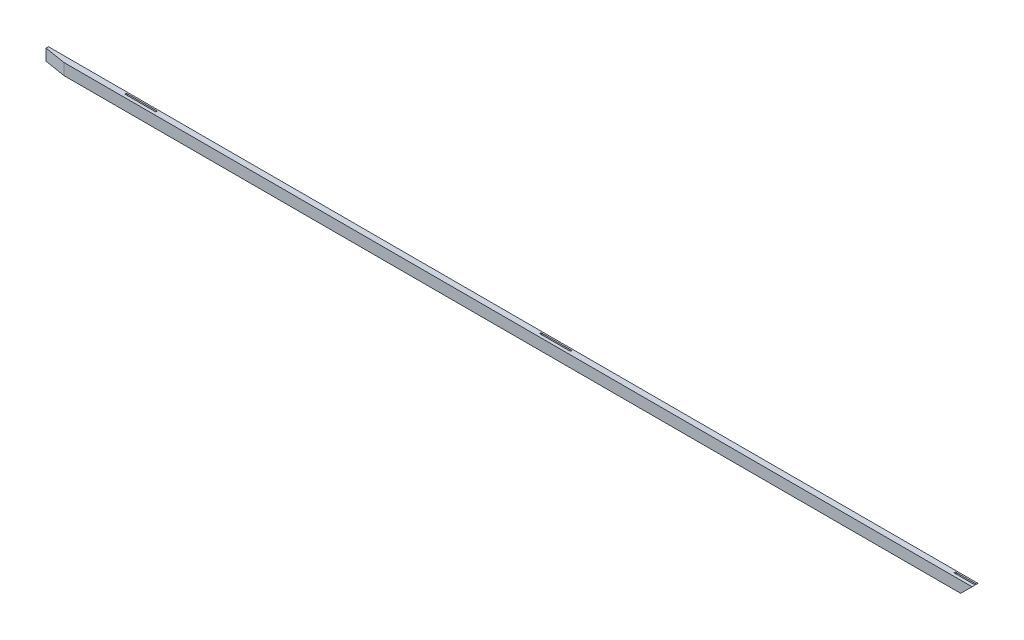
ISO-10303-21;
HEADER;
FILE_DESCRIPTION(('STEP AP214'),'2;1');
FILE_NAME('part.step','',(''),(''),'','','');
FILE_SCHEMA(('AUTOMOTIVE_DESIGN { 1 0 10303 214 1 1 1 1 }'));
ENDSEC;
DATA;
#1=APPLICATION_CONTEXT('core data for automotive mechanical design processes');
#2=APPLICATION_PROTOCOL_DEFINITION('international standard','automotive_design',2000,#1);
#3=PRODUCT_CONTEXT('',#1,'mechanical');
#4=PRODUCT('Part','Part','',(#3));
#5=PRODUCT_RELATED_PRODUCT_CATEGORY('part','',(#4));
#6=PRODUCT_DEFINITION_FORMATION('','',#4);
#7=PRODUCT_DEFINITION_CONTEXT('part definition',#1,'design');
#8=PRODUCT_DEFINITION('design','',#6,#7);
#9=PRODUCT_DEFINITION_SHAPE('','',#8);
#10=(LENGTH_UNIT() NAMED_UNIT(*) SI_UNIT(.MILLI.,.METRE.));
#11=(NAMED_UNIT(*) PLANE_ANGLE_UNIT() SI_UNIT($,.RADIAN.));
#12=(NAMED_UNIT(*) SI_UNIT($,.STERADIAN.) SOLID_ANGLE_UNIT());
#13=UNCERTAINTY_MEASURE_WITH_UNIT(LENGTH_MEASURE(1.E-05),#10,'distance_accuracy_value','');
#14=(GEOMETRIC_REPRESENTATION_CONTEXT(3) GLOBAL_UNCERTAINTY_ASSIGNED_CONTEXT((#13)) GLOBAL_UNIT_ASSIGNED_CONTEXT((#10,
#11,#12)) REPRESENTATION_CONTEXT('',''));
#15=CARTESIAN_POINT('',(0.,0.,0.));
#16=DIRECTION('',(0.,0.,1.));
#17=DIRECTION('',(1.,0.,0.));
#18=AXIS2_PLACEMENT_3D('',#15,#16,#17);
#19=CARTESIAN_POINT('',(3923.,24.0000000000013,25.));
#20=DIRECTION('',(0.,-1.,0.));
#21=DIRECTION('',(1.,0.,0.));
#22=AXIS2_PLACEMENT_3D('',#19,#20,#21);
#23=PLANE('',#22);
#24=DIRECTION('',(0.,0.,1.));
#25=VECTOR('',#24,1.);
#26=CARTESIAN_POINT('',(2085.,23.9999999999997,12.));
#27=LINE('',#26,#25);
#28=CARTESIAN_POINT('',(2085.,23.9999999999997,12.));
#29=VERTEX_POINT('',#28);
#30=CARTESIAN_POINT('',(2085.,23.9999999999997,6.));
#31=VERTEX_POINT('',#30);
#32=EDGE_CURVE('E290',#29,#31,#27,.F.);
#33=ORIENTED_EDGE('',*,*,#32,.T.);
#34=DIRECTION('',(1.,0.,0.));
#35=VECTOR('',#34,1.);
#36=CARTESIAN_POINT('',(2092.5,23.9999999999997,6.));
#37=LINE('',#36,#35);
#38=CARTESIAN_POINT('',(2215.,23.9999999999997,6.00000000000004));
#39=VERTEX_POINT('',#38);
#40=EDGE_CURVE('E301',#31,#39,#37,.T.);
#41=ORIENTED_EDGE('',*,*,#40,.T.);
#42=DIRECTION('',(0.,0.,-1.));
#43=VECTOR('',#42,1.);
#44=CARTESIAN_POINT('',(2215.,23.9999999999997,6.00000000000004));
#45=LINE('',#44,#43);
#46=CARTESIAN_POINT('',(2215.,23.9999999999997,12.));
#47=VERTEX_POINT('',#46);
#48=EDGE_CURVE('E283',#39,#47,#45,.F.);
#49=ORIENTED_EDGE('',*,*,#48,.T.);
#50=DIRECTION('',(-1.,0.,0.));
#51=VECTOR('',#50,1.);
#52=CARTESIAN_POINT('',(2207.5,23.9999999999997,12.));
#53=LINE('',#52,#51);
#54=EDGE_CURVE('E247',#47,#29,#53,.T.);
#55=ORIENTED_EDGE('',*,*,#54,.T.);
#56=EDGE_LOOP('',(#33,#41,#49,#55));
#57=FACE_BOUND('',#56,.T.);
#58=DIRECTION('',(0.,0.,1.));
#59=VECTOR('',#58,1.);
#60=CARTESIAN_POINT('',(335.,23.9999999999997,12.));
#61=LINE('',#60,#59);
#62=CARTESIAN_POINT('',(335.,23.9999999999997,12.));
#63=VERTEX_POINT('',#62);
#64=CARTESIAN_POINT('',(335.,23.9999999999997,6.));
#65=VERTEX_POINT('',#64);
#66=EDGE_CURVE('E345',#63,#65,#61,.F.);
#67=ORIENTED_EDGE('',*,*,#66,.T.);
#68=DIRECTION('',(1.,0.,0.));
#69=VECTOR('',#68,1.);
#70=CARTESIAN_POINT('',(342.5,23.9999999999997,6.));
#71=LINE('',#70,#69);
#72=CARTESIAN_POINT('',(465.,23.9999999999997,6.00000000000004));
#73=VERTEX_POINT('',#72);
#74=EDGE_CURVE('E11',#65,#73,#71,.T.);
#75=ORIENTED_EDGE('',*,*,#74,.T.);
#76=DIRECTION('',(0.,0.,-1.));
#77=VECTOR('',#76,1.);
#78=CARTESIAN_POINT('',(465.,23.9999999999997,6.00000000000004));
#79=LINE('',#78,#77);
#80=CARTESIAN_POINT('',(465.,23.9999999999997,12.));
#81=VERTEX_POINT('',#80);
#82=EDGE_CURVE('E358',#73,#81,#79,.F.);
#83=ORIENTED_EDGE('',*,*,#82,.T.);
#84=DIRECTION('',(-1.,0.,0.));
#85=VECTOR('',#84,1.);
#86=CARTESIAN_POINT('',(457.5,23.9999999999997,12.));
#87=LINE('',#86,#85);
#88=EDGE_CURVE('E335',#81,#63,#87,.T.);
#89=ORIENTED_EDGE('',*,*,#88,.T.);
#90=EDGE_LOOP('',(#67,#75,#83,#89));
#91=FACE_BOUND('',#90,.T.);
#92=DIRECTION('',(0.,0.,-1.));
#93=VECTOR('',#92,1.);
#94=CARTESIAN_POINT('',(0.,24.0000000000003,25.));
#95=LINE('',#94,#93);
#96=CARTESIAN_POINT('',(0.,24.0000000000003,10.));
#97=VERTEX_POINT('',#96);
#98=CARTESIAN_POINT('',(0.,24.0000000000003,0.));
#99=VERTEX_POINT('',#98);
#100=EDGE_CURVE('E240',#97,#99,#95,.T.);
#101=ORIENTED_EDGE('',*,*,#100,.F.);
#102=DIRECTION('',(-0.986393923832144,0.,-0.164398987305357));
#103=VECTOR('',#102,1.);
#104=CARTESIAN_POINT('',(0.,24.0000000000003,10.));
#105=LINE('',#104,#103);
#106=CARTESIAN_POINT('',(90.,24.0000000000013,25.));
#107=VERTEX_POINT('',#106);
#108=EDGE_CURVE('E225',#107,#97,#105,.T.);
#109=ORIENTED_EDGE('',*,*,#108,.F.);
#110=DIRECTION('',(-1.,0.,0.));
#111=VECTOR('',#110,1.);
#112=CARTESIAN_POINT('',(3923.,24.0000000000013,25.));
#113=LINE('',#112,#111);
#114=CARTESIAN_POINT('',(3923.,24.0000000000013,25.));
#115=VERTEX_POINT('',#114);
#116=EDGE_CURVE('E474',#115,#107,#113,.T.);
#117=ORIENTED_EDGE('',*,*,#116,.F.);
#118=DIRECTION('',(0.,0.,-1.));
#119=VECTOR('',#118,1.);
#120=CARTESIAN_POINT('',(3923.,24.0000000000013,25.));
#121=LINE('',#120,#119);
#122=CARTESIAN_POINT('',(3923.,24.0000000000013,12.));
#123=VERTEX_POINT('',#122);
#124=EDGE_CURVE('E490',#115,#123,#121,.T.);
#125=ORIENTED_EDGE('',*,*,#124,.T.);
#126=DIRECTION('',(-1.,0.,0.));
#127=VECTOR('',#126,1.);
#128=CARTESIAN_POINT('',(3923.,24.0000000000013,12.));
#129=LINE('',#128,#127);
#130=CARTESIAN_POINT('',(3833.5,24.0000000000013,12.));
#131=VERTEX_POINT('',#130);
#132=EDGE_CURVE('E773',#123,#131,#129,.T.);
#133=ORIENTED_EDGE('',*,*,#132,.T.);
#134=DIRECTION('',(0.,0.,1.));
#135=VECTOR('',#134,1.);
#136=CARTESIAN_POINT('',(3833.5,24.0000000000013,6.));
#137=LINE('',#136,#135);
#138=CARTESIAN_POINT('',(3833.5,24.0000000000013,6.));
#139=VERTEX_POINT('',#138);
#140=EDGE_CURVE('E772',#139,#131,#137,.T.);
#141=ORIENTED_EDGE('',*,*,#140,.F.);
#142=DIRECTION('',(-1.,0.,0.));
#143=VECTOR('',#142,1.);
#144=CARTESIAN_POINT('',(3923.,24.0000000000013,6.));
#145=LINE('',#144,#143);
#146=CARTESIAN_POINT('',(3923.,24.0000000000013,6.));
#147=VERTEX_POINT('',#146);
#148=EDGE_CURVE('E764',#147,#139,#145,.T.);
#149=ORIENTED_EDGE('',*,*,#148,.F.);
#150=CARTESIAN_POINT('',(3923.,24.0000000000013,0.));
#151=VERTEX_POINT('',#150);
#152=EDGE_CURVE('E476',#147,#151,#121,.T.);
#153=ORIENTED_EDGE('',*,*,#152,.T.);
#154=DIRECTION('',(-1.,0.,0.));
#155=VECTOR('',#154,1.);
#156=CARTESIAN_POINT('',(3923.,24.0000000000013,0.));
#157=LINE('',#156,#155);
#158=EDGE_CURVE('E246',#151,#99,#157,.T.);
#159=ORIENTED_EDGE('',*,*,#158,.T.);
#160=EDGE_LOOP('',(#101,#109,#117,#125,#133,#141,#149,#153,#159));
#161=FACE_BOUND('',#160,.T.);
#162=ADVANCED_FACE('F35',(#57,#91,#161),#23,.F.);
#163=CARTESIAN_POINT('',(3875.,-23.9999999999997,25.));
#164=DIRECTION('',(-0.707106781186545,0.70710678118655,0.));
#165=DIRECTION('',(-0.70710678118655,-0.707106781186545,0.));
#166=AXIS2_PLACEMENT_3D('',#163,#164,#165);
#167=PLANE('',#166);
#168=DIRECTION('',(0.707106781186561,0.707106781186534,0.));
#169=VECTOR('',#168,1.);
#170=CARTESIAN_POINT('',(3915.5,16.5000000000013,6.));
#171=LINE('',#170,#169);
#172=CARTESIAN_POINT('',(3915.5,16.5000000000013,6.));
#173=VERTEX_POINT('',#172);
#174=EDGE_CURVE('E768',#173,#147,#171,.T.);
#175=ORIENTED_EDGE('',*,*,#174,.F.);
#176=DIRECTION('',(0.,0.,1.));
#177=VECTOR('',#176,1.);
#178=CARTESIAN_POINT('',(3915.5,16.5000000000013,6.));
#179=LINE('',#178,#177);
#180=CARTESIAN_POINT('',(3915.5,16.5000000000013,12.));
#181=VERTEX_POINT('',#180);
#182=EDGE_CURVE('E778',#173,#181,#179,.T.);
#183=ORIENTED_EDGE('',*,*,#182,.T.);
#184=DIRECTION('',(0.707106781186561,0.707106781186534,0.));
#185=VECTOR('',#184,1.);
#186=CARTESIAN_POINT('',(3915.5,16.5000000000013,12.));
#187=LINE('',#186,#185);
#188=EDGE_CURVE('E769',#181,#123,#187,.T.);
#189=ORIENTED_EDGE('',*,*,#188,.T.);
#190=ORIENTED_EDGE('',*,*,#124,.F.);
#191=DIRECTION('',(0.70710678118655,0.707106781186545,0.));
#192=VECTOR('',#191,1.);
#193=CARTESIAN_POINT('',(3875.,-23.9999999999997,25.));
#194=LINE('',#193,#192);
#195=CARTESIAN_POINT('',(3875.,-23.9999999999997,25.));
#196=VERTEX_POINT('',#195);
#197=EDGE_CURVE('E473',#196,#115,#194,.T.);
#198=ORIENTED_EDGE('',*,*,#197,.F.);
#199=DIRECTION('',(0.,0.,-1.));
#200=VECTOR('',#199,1.);
#201=CARTESIAN_POINT('',(3875.,-23.9999999999997,25.));
#202=LINE('',#201,#200);
#203=CARTESIAN_POINT('',(3875.,-23.9999999999997,12.));
#204=VERTEX_POINT('',#203);
#205=EDGE_CURVE('E252',#196,#204,#202,.T.);
#206=ORIENTED_EDGE('',*,*,#205,.T.);
#207=DIRECTION('',(0.707106781186561,0.707106781186534,0.));
#208=VECTOR('',#207,1.);
#209=CARTESIAN_POINT('',(3882.5,-16.4999999999997,12.));
#210=LINE('',#209,#208);
#211=CARTESIAN_POINT('',(3882.5,-16.4999999999997,12.));
#212=VERTEX_POINT('',#211);
#213=EDGE_CURVE('E796',#204,#212,#210,.T.);
#214=ORIENTED_EDGE('',*,*,#213,.T.);
#215=DIRECTION('',(0.,0.,1.));
#216=VECTOR('',#215,1.);
#217=CARTESIAN_POINT('',(3882.5,-16.4999999999997,6.));
#218=LINE('',#217,#216);
#219=CARTESIAN_POINT('',(3882.5,-16.4999999999997,6.));
#220=VERTEX_POINT('',#219);
#221=EDGE_CURVE('E794',#220,#212,#218,.T.);
#222=ORIENTED_EDGE('',*,*,#221,.F.);
#223=DIRECTION('',(0.707106781186561,0.707106781186534,0.));
#224=VECTOR('',#223,1.);
#225=CARTESIAN_POINT('',(3882.5,-16.4999999999997,6.));
#226=LINE('',#225,#224);
#227=CARTESIAN_POINT('',(3875.,-23.9999999999997,6.));
#228=VERTEX_POINT('',#227);
#229=EDGE_CURVE('E501',#228,#220,#226,.T.);
#230=ORIENTED_EDGE('',*,*,#229,.F.);
#231=CARTESIAN_POINT('',(3875.,-23.9999999999997,0.));
#232=VERTEX_POINT('',#231);
#233=EDGE_CURVE('E492',#228,#232,#202,.T.);
#234=ORIENTED_EDGE('',*,*,#233,.T.);
#235=DIRECTION('',(0.70710678118655,0.707106781186545,0.));
#236=VECTOR('',#235,1.);
#237=CARTESIAN_POINT('',(3875.,-23.9999999999997,0.));
#238=LINE('',#237,#236);
#239=EDGE_CURVE('E478',#232,#151,#238,.T.);
#240=ORIENTED_EDGE('',*,*,#239,.T.);
#241=ORIENTED_EDGE('',*,*,#152,.F.);
#242=EDGE_LOOP('',(#175,#183,#189,#190,#198,#206,#214,#222,#230,#234,#240,#241));
#243=FACE_BOUND('',#242,.T.);
#244=ADVANCED_FACE('F391',(#243),#167,.F.);
#245=CARTESIAN_POINT('',(342.5,16.4999999999997,6.));
#246=DIRECTION('',(0.,0.,-1.));
#247=DIRECTION('',(-1.,0.,0.));
#248=AXIS2_PLACEMENT_3D('',#245,#246,#247);
#249=PLANE('',#248);
#250=ORIENTED_EDGE('',*,*,#74,.F.);
#251=DIRECTION('',(0.707106781186549,-0.707106781186546,0.));
#252=VECTOR('',#251,1.);
#253=CARTESIAN_POINT('',(342.5,16.4999999999997,6.));
#254=LINE('',#253,#252);
#255=CARTESIAN_POINT('',(342.5,16.4999999999997,6.));
#256=VERTEX_POINT('',#255);
#257=EDGE_CURVE('E349',#256,#65,#254,.F.);
#258=ORIENTED_EDGE('',*,*,#257,.F.);
#259=DIRECTION('',(1.,0.,0.));
#260=VECTOR('',#259,1.);
#261=CARTESIAN_POINT('',(342.5,16.4999999999997,6.));
#262=LINE('',#261,#260);
#263=CARTESIAN_POINT('',(457.5,16.4999999999997,6.00000000000004));
#264=VERTEX_POINT('',#263);
#265=EDGE_CURVE('E355',#256,#264,#262,.T.);
#266=ORIENTED_EDGE('',*,*,#265,.T.);
#267=DIRECTION('',(-0.707106781186549,-0.707106781186546,0.));
#268=VECTOR('',#267,1.);
#269=CARTESIAN_POINT('',(400.,-41.0000000000004,6.00000000000002));
#270=LINE('',#269,#268);
#271=EDGE_CURVE('E43',#264,#73,#270,.F.);
#272=ORIENTED_EDGE('',*,*,#271,.T.);
#273=EDGE_LOOP('',(#250,#258,#266,#272));
#274=FACE_BOUND('',#273,.T.);
#275=ADVANCED_FACE('F37',(#274),#249,.F.);
#276=CARTESIAN_POINT('',(457.5,16.4999999999997,6.00000000000004));
#277=DIRECTION('',(-0.707106781186546,0.707106781186549,0.));
#278=DIRECTION('',(0.707106781186549,0.707106781186546,0.));
#279=AXIS2_PLACEMENT_3D('',#276,#277,#278);
#280=PLANE('',#279);
#281=ORIENTED_EDGE('',*,*,#82,.F.);
#282=ORIENTED_EDGE('',*,*,#271,.F.);
#283=DIRECTION('',(0.,0.,1.));
#284=VECTOR('',#283,1.);
#285=CARTESIAN_POINT('',(457.5,16.4999999999997,6.00000000000004));
#286=LINE('',#285,#284);
#287=CARTESIAN_POINT('',(457.5,16.4999999999997,12.));
#288=VERTEX_POINT('',#287);
#289=EDGE_CURVE('E352',#264,#288,#286,.T.);
#290=ORIENTED_EDGE('',*,*,#289,.T.);
#291=DIRECTION('',(-0.707106781186549,-0.707106781186546,0.));
#292=VECTOR('',#291,1.);
#293=CARTESIAN_POINT('',(457.5,16.4999999999997,12.));
#294=LINE('',#293,#292);
#295=EDGE_CURVE('E337',#288,#81,#294,.F.);
#296=ORIENTED_EDGE('',*,*,#295,.T.);
#297=EDGE_LOOP('',(#281,#282,#290,#296));
#298=FACE_BOUND('',#297,.T.);
#299=ADVANCED_FACE('F376',(#298),#280,.T.);
#300=CARTESIAN_POINT('',(-1750.,16.4999999999997,0.));
#301=DIRECTION('',(0.,1.,0.));
#302=DIRECTION('',(0.,0.,-1.));
#303=AXIS2_PLACEMENT_3D('',#300,#301,#302);
#304=PLANE('',#303);
#305=DIRECTION('',(-1.,0.,0.));
#306=VECTOR('',#305,1.);
#307=CARTESIAN_POINT('',(457.5,16.4999999999997,12.));
#308=LINE('',#307,#306);
#309=CARTESIAN_POINT('',(342.5,16.4999999999997,12.));
#310=VERTEX_POINT('',#309);
#311=EDGE_CURVE('E340',#288,#310,#308,.T.);
#312=ORIENTED_EDGE('',*,*,#311,.F.);
#313=ORIENTED_EDGE('',*,*,#289,.F.);
#314=ORIENTED_EDGE('',*,*,#265,.F.);
#315=DIRECTION('',(0.,0.,-1.));
#316=VECTOR('',#315,1.);
#317=CARTESIAN_POINT('',(342.5,16.4999999999997,12.));
#318=LINE('',#317,#316);
#319=EDGE_CURVE('E347',#310,#256,#318,.T.);
#320=ORIENTED_EDGE('',*,*,#319,.F.);
#321=EDGE_LOOP('',(#312,#313,#314,#320));
#322=FACE_BOUND('',#321,.T.);
#323=ADVANCED_FACE('F375',(#322),#304,.T.);
#324=CARTESIAN_POINT('',(342.5,16.4999999999997,12.));
#325=DIRECTION('',(0.707106781186546,0.707106781186549,0.));
#326=DIRECTION('',(0.707106781186549,-0.707106781186546,0.));
#327=AXIS2_PLACEMENT_3D('',#324,#325,#326);
#328=PLANE('',#327);
#329=ORIENTED_EDGE('',*,*,#66,.F.);
#330=DIRECTION('',(0.707106781186549,-0.707106781186546,0.));
#331=VECTOR('',#330,1.);
#332=CARTESIAN_POINT('',(400.,-41.0000000000004,12.));
#333=LINE('',#332,#331);
#334=EDGE_CURVE('E342',#310,#63,#333,.F.);
#335=ORIENTED_EDGE('',*,*,#334,.F.);
#336=ORIENTED_EDGE('',*,*,#319,.T.);
#337=ORIENTED_EDGE('',*,*,#257,.T.);
#338=EDGE_LOOP('',(#329,#335,#336,#337));
#339=FACE_BOUND('',#338,.T.);
#340=ADVANCED_FACE('F371',(#339),#328,.T.);
#341=CARTESIAN_POINT('',(457.5,16.4999999999997,12.));
#342=DIRECTION('',(0.,0.,1.));
#343=DIRECTION('',(1.,0.,0.));
#344=AXIS2_PLACEMENT_3D('',#341,#342,#343);
#345=PLANE('',#344);
#346=ORIENTED_EDGE('',*,*,#88,.F.);
#347=ORIENTED_EDGE('',*,*,#295,.F.);
#348=ORIENTED_EDGE('',*,*,#311,.T.);
#349=ORIENTED_EDGE('',*,*,#334,.T.);
#350=EDGE_LOOP('',(#346,#347,#348,#349));
#351=FACE_BOUND('',#350,.T.);
#352=ADVANCED_FACE('F378',(#351),#345,.F.);
#353=CARTESIAN_POINT('',(342.5,-16.4999999999997,6.));
#354=DIRECTION('',(0.,0.,-1.));
#355=DIRECTION('',(-1.,0.,0.));
#356=AXIS2_PLACEMENT_3D('',#353,#354,#355);
#357=PLANE('',#356);
#358=DIRECTION('',(1.,0.,0.));
#359=VECTOR('',#358,1.);
#360=CARTESIAN_POINT('',(342.5,-23.9999999999997,6.));
#361=LINE('',#360,#359);
#362=CARTESIAN_POINT('',(335.,-23.9999999999997,6.));
#363=VERTEX_POINT('',#362);
#364=CARTESIAN_POINT('',(465.,-23.9999999999997,6.00000000000004));
#365=VERTEX_POINT('',#364);
#366=EDGE_CURVE('E332',#363,#365,#361,.T.);
#367=ORIENTED_EDGE('',*,*,#366,.T.);
#368=DIRECTION('',(-0.707106781186549,0.707106781186546,0.));
#369=VECTOR('',#368,1.);
#370=CARTESIAN_POINT('',(400.,41.0000000000004,6.00000000000002));
#371=LINE('',#370,#369);
#372=CARTESIAN_POINT('',(457.5,-16.4999999999997,6.00000000000004));
#373=VERTEX_POINT('',#372);
#374=EDGE_CURVE('E329',#373,#365,#371,.F.);
#375=ORIENTED_EDGE('',*,*,#374,.F.);
#376=DIRECTION('',(1.,0.,0.));
#377=VECTOR('',#376,1.);
#378=CARTESIAN_POINT('',(342.5,-16.4999999999997,6.));
#379=LINE('',#378,#377);
#380=CARTESIAN_POINT('',(342.5,-16.4999999999997,6.));
#381=VERTEX_POINT('',#380);
#382=EDGE_CURVE('E307',#381,#373,#379,.T.);
#383=ORIENTED_EDGE('',*,*,#382,.F.);
#384=DIRECTION('',(0.707106781186549,0.707106781186546,0.));
#385=VECTOR('',#384,1.);
#386=CARTESIAN_POINT('',(342.5,-16.4999999999997,6.));
#387=LINE('',#386,#385);
#388=EDGE_CURVE('E314',#381,#363,#387,.F.);
#389=ORIENTED_EDGE('',*,*,#388,.T.);
#390=EDGE_LOOP('',(#367,#375,#383,#389));
#391=FACE_BOUND('',#390,.T.);
#392=ADVANCED_FACE('F380',(#391),#357,.F.);
#393=CARTESIAN_POINT('',(457.5,-16.4999999999997,6.00000000000004));
#394=DIRECTION('',(-0.707106781186546,-0.707106781186549,0.));
#395=DIRECTION('',(0.707106781186549,-0.707106781186546,0.));
#396=AXIS2_PLACEMENT_3D('',#393,#394,#395);
#397=PLANE('',#396);
#398=DIRECTION('',(0.,0.,-1.));
#399=VECTOR('',#398,1.);
#400=CARTESIAN_POINT('',(465.,-23.9999999999997,6.00000000000004));
#401=LINE('',#400,#399);
#402=CARTESIAN_POINT('',(465.,-23.9999999999997,12.));
#403=VERTEX_POINT('',#402);
#404=EDGE_CURVE('E326',#365,#403,#401,.F.);
#405=ORIENTED_EDGE('',*,*,#404,.T.);
#406=DIRECTION('',(-0.707106781186549,0.707106781186546,0.));
#407=VECTOR('',#406,1.);
#408=CARTESIAN_POINT('',(457.5,-16.4999999999997,12.));
#409=LINE('',#408,#407);
#410=CARTESIAN_POINT('',(457.5,-16.4999999999997,12.));
#411=VERTEX_POINT('',#410);
#412=EDGE_CURVE('E323',#411,#403,#409,.F.);
#413=ORIENTED_EDGE('',*,*,#412,.F.);
#414=DIRECTION('',(0.,0.,1.));
#415=VECTOR('',#414,1.);
#416=CARTESIAN_POINT('',(457.5,-16.4999999999997,6.00000000000004));
#417=LINE('',#416,#415);
#418=EDGE_CURVE('E309',#373,#411,#417,.T.);
#419=ORIENTED_EDGE('',*,*,#418,.F.);
#420=ORIENTED_EDGE('',*,*,#374,.T.);
#421=EDGE_LOOP('',(#405,#413,#419,#420));
#422=FACE_BOUND('',#421,.T.);
#423=ADVANCED_FACE('F386',(#422),#397,.T.);
#424=CARTESIAN_POINT('',(457.5,-16.4999999999997,12.));
#425=DIRECTION('',(0.,0.,1.));
#426=DIRECTION('',(1.,0.,0.));
#427=AXIS2_PLACEMENT_3D('',#424,#425,#426);
#428=PLANE('',#427);
#429=DIRECTION('',(-1.,0.,0.));
#430=VECTOR('',#429,1.);
#431=CARTESIAN_POINT('',(457.5,-23.9999999999997,12.));
#432=LINE('',#431,#430);
#433=CARTESIAN_POINT('',(335.,-23.9999999999997,12.));
#434=VERTEX_POINT('',#433);
#435=EDGE_CURVE('E320',#403,#434,#432,.T.);
#436=ORIENTED_EDGE('',*,*,#435,.T.);
#437=DIRECTION('',(0.707106781186549,0.707106781186546,0.));
#438=VECTOR('',#437,1.);
#439=CARTESIAN_POINT('',(400.,41.0000000000004,12.));
#440=LINE('',#439,#438);
#441=CARTESIAN_POINT('',(342.5,-16.4999999999997,12.));
#442=VERTEX_POINT('',#441);
#443=EDGE_CURVE('E317',#442,#434,#440,.F.);
#444=ORIENTED_EDGE('',*,*,#443,.F.);
#445=DIRECTION('',(-1.,0.,0.));
#446=VECTOR('',#445,1.);
#447=CARTESIAN_POINT('',(457.5,-16.4999999999997,12.));
#448=LINE('',#447,#446);
#449=EDGE_CURVE('E303',#411,#442,#448,.T.);
#450=ORIENTED_EDGE('',*,*,#449,.F.);
#451=ORIENTED_EDGE('',*,*,#412,.T.);
#452=EDGE_LOOP('',(#436,#444,#450,#451));
#453=FACE_BOUND('',#452,.T.);
#454=ADVANCED_FACE('F440',(#453),#428,.F.);
#455=CARTESIAN_POINT('',(342.5,-16.4999999999997,12.));
#456=DIRECTION('',(0.707106781186546,-0.707106781186549,0.));
#457=DIRECTION('',(0.707106781186549,0.707106781186546,0.));
#458=AXIS2_PLACEMENT_3D('',#455,#456,#457);
#459=PLANE('',#458);
#460=DIRECTION('',(0.,0.,1.));
#461=VECTOR('',#460,1.);
#462=CARTESIAN_POINT('',(335.,-23.9999999999997,12.));
#463=LINE('',#462,#461);
#464=EDGE_CURVE('E312',#434,#363,#463,.F.);
#465=ORIENTED_EDGE('',*,*,#464,.T.);
#466=ORIENTED_EDGE('',*,*,#388,.F.);
#467=DIRECTION('',(0.,0.,-1.));
#468=VECTOR('',#467,1.);
#469=CARTESIAN_POINT('',(342.5,-16.4999999999997,12.));
#470=LINE('',#469,#468);
#471=EDGE_CURVE('E305',#442,#381,#470,.T.);
#472=ORIENTED_EDGE('',*,*,#471,.F.);
#473=ORIENTED_EDGE('',*,*,#443,.T.);
#474=EDGE_LOOP('',(#465,#466,#472,#473));
#475=FACE_BOUND('',#474,.T.);
#476=ADVANCED_FACE('F436',(#475),#459,.T.);
#477=CARTESIAN_POINT('',(-1750.,-16.4999999999997,0.));
#478=DIRECTION('',(0.,-1.,0.));
#479=DIRECTION('',(0.,0.,-1.));
#480=AXIS2_PLACEMENT_3D('',#477,#478,#479);
#481=PLANE('',#480);
#482=ORIENTED_EDGE('',*,*,#449,.T.);
#483=ORIENTED_EDGE('',*,*,#471,.T.);
#484=ORIENTED_EDGE('',*,*,#382,.T.);
#485=ORIENTED_EDGE('',*,*,#418,.T.);
#486=EDGE_LOOP('',(#482,#483,#484,#485));
#487=FACE_BOUND('',#486,.T.);
#488=ADVANCED_FACE('F432',(#487),#481,.T.);
#489=CARTESIAN_POINT('',(2092.5,16.4999999999997,6.));
#490=DIRECTION('',(0.,0.,-1.));
#491=DIRECTION('',(-1.,0.,0.));
#492=AXIS2_PLACEMENT_3D('',#489,#490,#491);
#493=PLANE('',#492);
#494=ORIENTED_EDGE('',*,*,#40,.F.);
#495=DIRECTION('',(0.707106781186549,-0.707106781186546,0.));
#496=VECTOR('',#495,1.);
#497=CARTESIAN_POINT('',(2092.5,16.4999999999997,6.));
#498=LINE('',#497,#496);
#499=CARTESIAN_POINT('',(2092.5,16.4999999999997,6.));
#500=VERTEX_POINT('',#499);
#501=EDGE_CURVE('E293',#500,#31,#498,.F.);
#502=ORIENTED_EDGE('',*,*,#501,.F.);
#503=DIRECTION('',(1.,0.,0.));
#504=VECTOR('',#503,1.);
#505=CARTESIAN_POINT('',(2092.5,16.4999999999997,6.));
#506=LINE('',#505,#504);
#507=CARTESIAN_POINT('',(2207.5,16.4999999999997,6.00000000000004));
#508=VERTEX_POINT('',#507);
#509=EDGE_CURVE('E299',#500,#508,#506,.T.);
#510=ORIENTED_EDGE('',*,*,#509,.T.);
#511=DIRECTION('',(-0.707106781186549,-0.707106781186546,0.));
#512=VECTOR('',#511,1.);
#513=CARTESIAN_POINT('',(2150.,-41.0000000000004,6.00000000000002));
#514=LINE('',#513,#512);
#515=EDGE_CURVE('E287',#508,#39,#514,.F.);
#516=ORIENTED_EDGE('',*,*,#515,.T.);
#517=EDGE_LOOP('',(#494,#502,#510,#516));
#518=FACE_BOUND('',#517,.T.);
#519=ADVANCED_FACE('F428',(#518),#493,.F.);
#520=CARTESIAN_POINT('',(0.,16.4999999999997,0.));
#521=DIRECTION('',(0.,1.,0.));
#522=DIRECTION('',(0.,0.,-1.));
#523=AXIS2_PLACEMENT_3D('',#520,#521,#522);
#524=PLANE('',#523);
#525=DIRECTION('',(-1.,0.,0.));
#526=VECTOR('',#525,1.);
#527=CARTESIAN_POINT('',(2207.5,16.4999999999997,12.));
#528=LINE('',#527,#526);
#529=CARTESIAN_POINT('',(2207.5,16.4999999999997,12.));
#530=VERTEX_POINT('',#529);
#531=CARTESIAN_POINT('',(2092.5,16.4999999999997,12.));
#532=VERTEX_POINT('',#531);
#533=EDGE_CURVE('E277',#530,#532,#528,.T.);
#534=ORIENTED_EDGE('',*,*,#533,.F.);
#535=DIRECTION('',(0.,0.,1.));
#536=VECTOR('',#535,1.);
#537=CARTESIAN_POINT('',(2207.5,16.4999999999997,6.00000000000004));
#538=LINE('',#537,#536);
#539=EDGE_CURVE('E285',#508,#530,#538,.T.);
#540=ORIENTED_EDGE('',*,*,#539,.F.);
#541=ORIENTED_EDGE('',*,*,#509,.F.);
#542=DIRECTION('',(0.,0.,-1.));
#543=VECTOR('',#542,1.);
#544=CARTESIAN_POINT('',(2092.5,16.4999999999997,12.));
#545=LINE('',#544,#543);
#546=EDGE_CURVE('E296',#532,#500,#545,.T.);
#547=ORIENTED_EDGE('',*,*,#546,.F.);
#548=EDGE_LOOP('',(#534,#540,#541,#547));
#549=FACE_BOUND('',#548,.T.);
#550=ADVANCED_FACE('F424',(#549),#524,.T.);
#551=CARTESIAN_POINT('',(2092.5,16.4999999999997,12.));
#552=DIRECTION('',(0.707106781186546,0.707106781186549,0.));
#553=DIRECTION('',(0.707106781186549,-0.707106781186546,0.));
#554=AXIS2_PLACEMENT_3D('',#551,#552,#553);
#555=PLANE('',#554);
#556=ORIENTED_EDGE('',*,*,#32,.F.);
#557=DIRECTION('',(0.707106781186549,-0.707106781186546,0.));
#558=VECTOR('',#557,1.);
#559=CARTESIAN_POINT('',(2150.,-41.0000000000004,12.));
#560=LINE('',#559,#558);
#561=EDGE_CURVE('E250',#532,#29,#560,.F.);
#562=ORIENTED_EDGE('',*,*,#561,.F.);
#563=ORIENTED_EDGE('',*,*,#546,.T.);
#564=ORIENTED_EDGE('',*,*,#501,.T.);
#565=EDGE_LOOP('',(#556,#562,#563,#564));
#566=FACE_BOUND('',#565,.T.);
#567=ADVANCED_FACE('F420',(#566),#555,.T.);
#568=CARTESIAN_POINT('',(2207.5,16.4999999999997,6.00000000000004));
#569=DIRECTION('',(-0.707106781186546,0.707106781186549,0.));
#570=DIRECTION('',(0.707106781186549,0.707106781186546,0.));
#571=AXIS2_PLACEMENT_3D('',#568,#569,#570);
#572=PLANE('',#571);
#573=ORIENTED_EDGE('',*,*,#48,.F.);
#574=ORIENTED_EDGE('',*,*,#515,.F.);
#575=ORIENTED_EDGE('',*,*,#539,.T.);
#576=DIRECTION('',(-0.707106781186549,-0.707106781186546,0.));
#577=VECTOR('',#576,1.);
#578=CARTESIAN_POINT('',(2207.5,16.4999999999997,12.));
#579=LINE('',#578,#577);
#580=EDGE_CURVE('E280',#530,#47,#579,.F.);
#581=ORIENTED_EDGE('',*,*,#580,.T.);
#582=EDGE_LOOP('',(#573,#574,#575,#581));
#583=FACE_BOUND('',#582,.T.);
#584=ADVANCED_FACE('F416',(#583),#572,.T.);
#585=CARTESIAN_POINT('',(2207.5,16.4999999999997,12.));
#586=DIRECTION('',(0.,0.,1.));
#587=DIRECTION('',(1.,0.,0.));
#588=AXIS2_PLACEMENT_3D('',#585,#586,#587);
#589=PLANE('',#588);
#590=ORIENTED_EDGE('',*,*,#54,.F.);
#591=ORIENTED_EDGE('',*,*,#580,.F.);
#592=ORIENTED_EDGE('',*,*,#533,.T.);
#593=ORIENTED_EDGE('',*,*,#561,.T.);
#594=EDGE_LOOP('',(#590,#591,#592,#593));
#595=FACE_BOUND('',#594,.T.);
#596=ADVANCED_FACE('F413',(#595),#589,.F.);
#597=CARTESIAN_POINT('',(0.,24.0000000000003,25.));
#598=DIRECTION('',(1.,0.,0.));
#599=DIRECTION('',(0.,0.,-1.));
#600=AXIS2_PLACEMENT_3D('',#597,#598,#599);
#601=PLANE('',#600);
#602=DIRECTION('',(0.,0.,-1.));
#603=VECTOR('',#602,1.);
#604=CARTESIAN_POINT('',(0.,-23.9999999999997,25.));
#605=LINE('',#604,#603);
#606=CARTESIAN_POINT('',(0.,-23.9999999999997,10.));
#607=VERTEX_POINT('',#606);
#608=CARTESIAN_POINT('',(0.,-23.9999999999997,0.));
#609=VERTEX_POINT('',#608);
#610=EDGE_CURVE('E242',#607,#609,#605,.T.);
#611=ORIENTED_EDGE('',*,*,#610,.F.);
#612=DIRECTION('',(0.,-1.,0.));
#613=VECTOR('',#612,1.);
#614=CARTESIAN_POINT('',(0.,24.0010000000013,10.));
#615=LINE('',#614,#613);
#616=EDGE_CURVE('E228',#97,#607,#615,.T.);
#617=ORIENTED_EDGE('',*,*,#616,.F.);
#618=ORIENTED_EDGE('',*,*,#100,.T.);
#619=DIRECTION('',(0.,-1.,0.));
#620=VECTOR('',#619,1.);
#621=CARTESIAN_POINT('',(0.,24.0000000000003,0.));
#622=LINE('',#621,#620);
#623=EDGE_CURVE('E483',#99,#609,#622,.T.);
#624=ORIENTED_EDGE('',*,*,#623,.T.);
#625=EDGE_LOOP('',(#611,#617,#618,#624));
#626=FACE_BOUND('',#625,.T.);
#627=ADVANCED_FACE('F238',(#626),#601,.F.);
#628=CARTESIAN_POINT('',(0.,-23.9999999999997,25.));
#629=DIRECTION('',(0.,1.,0.));
#630=DIRECTION('',(0.,0.,1.));
#631=AXIS2_PLACEMENT_3D('',#628,#629,#630);
#632=PLANE('',#631);
#633=ORIENTED_EDGE('',*,*,#464,.F.);
#634=ORIENTED_EDGE('',*,*,#435,.F.);
#635=ORIENTED_EDGE('',*,*,#404,.F.);
#636=ORIENTED_EDGE('',*,*,#366,.F.);
#637=EDGE_LOOP('',(#633,#634,#635,#636));
#638=FACE_BOUND('',#637,.T.);
#639=DIRECTION('',(0.,0.,1.));
#640=VECTOR('',#639,1.);
#641=CARTESIAN_POINT('',(2085.,-23.9999999999997,12.));
#642=LINE('',#641,#640);
#643=CARTESIAN_POINT('',(2085.,-23.9999999999997,12.));
#644=VERTEX_POINT('',#643);
#645=CARTESIAN_POINT('',(2085.,-23.9999999999997,6.));
#646=VERTEX_POINT('',#645);
#647=EDGE_CURVE('E266',#644,#646,#642,.F.);
#648=ORIENTED_EDGE('',*,*,#647,.F.);
#649=DIRECTION('',(-1.,0.,0.));
#650=VECTOR('',#649,1.);
#651=CARTESIAN_POINT('',(2207.5,-23.9999999999997,12.));
#652=LINE('',#651,#650);
#653=CARTESIAN_POINT('',(2215.,-23.9999999999997,12.));
#654=VERTEX_POINT('',#653);
#655=EDGE_CURVE('E269',#654,#644,#652,.T.);
#656=ORIENTED_EDGE('',*,*,#655,.F.);
#657=DIRECTION('',(0.,0.,-1.));
#658=VECTOR('',#657,1.);
#659=CARTESIAN_POINT('',(2215.,-23.9999999999997,6.00000000000004));
#660=LINE('',#659,#658);
#661=CARTESIAN_POINT('',(2215.,-23.9999999999997,6.00000000000004));
#662=VERTEX_POINT('',#661);
#663=EDGE_CURVE('E256',#662,#654,#660,.F.);
#664=ORIENTED_EDGE('',*,*,#663,.F.);
#665=DIRECTION('',(1.,0.,0.));
#666=VECTOR('',#665,1.);
#667=CARTESIAN_POINT('',(2092.5,-23.9999999999997,6.));
#668=LINE('',#667,#666);
#669=EDGE_CURVE('E260',#646,#662,#668,.T.);
#670=ORIENTED_EDGE('',*,*,#669,.F.);
#671=EDGE_LOOP('',(#648,#656,#664,#670));
#672=FACE_BOUND('',#671,.T.);
#673=DIRECTION('',(1.,0.,0.));
#674=VECTOR('',#673,1.);
#675=CARTESIAN_POINT('',(0.,-23.9999999999997,25.));
#676=LINE('',#675,#674);
#677=CARTESIAN_POINT('',(90.,-23.9999999999997,25.));
#678=VERTEX_POINT('',#677);
#679=EDGE_CURVE('E468',#678,#196,#676,.T.);
#680=ORIENTED_EDGE('',*,*,#679,.F.);
#681=DIRECTION('',(0.986393923832144,0.,0.164398987305357));
#682=VECTOR('',#681,1.);
#683=CARTESIAN_POINT('',(0.,-23.9999999999997,10.));
#684=LINE('',#683,#682);
#685=EDGE_CURVE('E50',#607,#678,#684,.T.);
#686=ORIENTED_EDGE('',*,*,#685,.F.);
#687=ORIENTED_EDGE('',*,*,#610,.T.);
#688=DIRECTION('',(1.,0.,0.));
#689=VECTOR('',#688,1.);
#690=CARTESIAN_POINT('',(0.,-23.9999999999997,0.));
#691=LINE('',#690,#689);
#692=EDGE_CURVE('E485',#609,#232,#691,.T.);
#693=ORIENTED_EDGE('',*,*,#692,.T.);
#694=ORIENTED_EDGE('',*,*,#233,.F.);
#695=DIRECTION('',(1.,0.,0.));
#696=VECTOR('',#695,1.);
#697=CARTESIAN_POINT('',(3875.,-23.9999999999997,6.));
#698=LINE('',#697,#696);
#699=CARTESIAN_POINT('',(3833.5,-23.9999999999996,6.));
#700=VERTEX_POINT('',#699);
#701=EDGE_CURVE('E784',#700,#228,#698,.T.);
#702=ORIENTED_EDGE('',*,*,#701,.F.);
#703=DIRECTION('',(0.,0.,1.));
#704=VECTOR('',#703,1.);
#705=CARTESIAN_POINT('',(3833.5,-23.9999999999996,6.));
#706=LINE('',#705,#704);
#707=CARTESIAN_POINT('',(3833.5,-23.9999999999996,12.));
#708=VERTEX_POINT('',#707);
#709=EDGE_CURVE('E801',#700,#708,#706,.T.);
#710=ORIENTED_EDGE('',*,*,#709,.T.);
#711=DIRECTION('',(1.,0.,0.));
#712=VECTOR('',#711,1.);
#713=CARTESIAN_POINT('',(3875.,-23.9999999999997,12.));
#714=LINE('',#713,#712);
#715=EDGE_CURVE('E234',#708,#204,#714,.T.);
#716=ORIENTED_EDGE('',*,*,#715,.T.);
#717=ORIENTED_EDGE('',*,*,#205,.F.);
#718=EDGE_LOOP('',(#680,#686,#687,#693,#694,#702,#710,#716,#717));
#719=FACE_BOUND('',#718,.T.);
#720=ADVANCED_FACE('F454',(#638,#672,#719),#632,.F.);
#721=CARTESIAN_POINT('',(0.,0.,25.));
#722=DIRECTION('',(0.,0.,1.));
#723=DIRECTION('',(1.,0.,0.));
#724=AXIS2_PLACEMENT_3D('',#721,#722,#723);
#725=PLANE('',#724);
#726=DIRECTION('',(0.,-1.,0.));
#727=VECTOR('',#726,1.);
#728=CARTESIAN_POINT('',(90.,24.0010000000013,25.));
#729=LINE('',#728,#727);
#730=EDGE_CURVE('E229',#107,#678,#729,.T.);
#731=ORIENTED_EDGE('',*,*,#730,.T.);
#732=ORIENTED_EDGE('',*,*,#679,.T.);
#733=ORIENTED_EDGE('',*,*,#197,.T.);
#734=ORIENTED_EDGE('',*,*,#116,.T.);
#735=EDGE_LOOP('',(#731,#732,#733,#734));
#736=FACE_BOUND('',#735,.T.);
#737=ADVANCED_FACE('F461',(#736),#725,.T.);
#738=CARTESIAN_POINT('',(0.,0.,0.));
#739=DIRECTION('',(0.,0.,1.));
#740=DIRECTION('',(1.,0.,0.));
#741=AXIS2_PLACEMENT_3D('',#738,#739,#740);
#742=PLANE('',#741);
#743=ORIENTED_EDGE('',*,*,#158,.F.);
#744=ORIENTED_EDGE('',*,*,#239,.F.);
#745=ORIENTED_EDGE('',*,*,#692,.F.);
#746=ORIENTED_EDGE('',*,*,#623,.F.);
#747=EDGE_LOOP('',(#743,#744,#745,#746));
#748=FACE_BOUND('',#747,.T.);
#749=ADVANCED_FACE('F505',(#748),#742,.F.);
#750=CARTESIAN_POINT('',(2207.5,-16.4999999999997,12.));
#751=DIRECTION('',(0.,0.,1.));
#752=DIRECTION('',(1.,0.,0.));
#753=AXIS2_PLACEMENT_3D('',#750,#751,#752);
#754=PLANE('',#753);
#755=ORIENTED_EDGE('',*,*,#655,.T.);
#756=DIRECTION('',(0.707106781186549,0.707106781186546,0.));
#757=VECTOR('',#756,1.);
#758=CARTESIAN_POINT('',(2150.,41.0000000000004,12.));
#759=LINE('',#758,#757);
#760=CARTESIAN_POINT('',(2092.5,-16.4999999999997,12.));
#761=VERTEX_POINT('',#760);
#762=EDGE_CURVE('E270',#761,#644,#759,.F.);
#763=ORIENTED_EDGE('',*,*,#762,.F.);
#764=DIRECTION('',(-1.,0.,0.));
#765=VECTOR('',#764,1.);
#766=CARTESIAN_POINT('',(2207.5,-16.4999999999997,12.));
#767=LINE('',#766,#765);
#768=CARTESIAN_POINT('',(2207.5,-16.4999999999997,12.));
#769=VERTEX_POINT('',#768);
#770=EDGE_CURVE('E259',#769,#761,#767,.T.);
#771=ORIENTED_EDGE('',*,*,#770,.F.);
#772=DIRECTION('',(-0.707106781186549,0.707106781186546,0.));
#773=VECTOR('',#772,1.);
#774=CARTESIAN_POINT('',(2207.5,-16.4999999999997,12.));
#775=LINE('',#774,#773);
#776=EDGE_CURVE('E263',#769,#654,#775,.F.);
#777=ORIENTED_EDGE('',*,*,#776,.T.);
#778=EDGE_LOOP('',(#755,#763,#771,#777));
#779=FACE_BOUND('',#778,.T.);
#780=ADVANCED_FACE('F406',(#779),#754,.F.);
#781=CARTESIAN_POINT('',(2207.5,-16.4999999999997,6.00000000000004));
#782=DIRECTION('',(-0.707106781186546,-0.707106781186549,0.));
#783=DIRECTION('',(0.707106781186549,-0.707106781186546,0.));
#784=AXIS2_PLACEMENT_3D('',#781,#782,#783);
#785=PLANE('',#784);
#786=ORIENTED_EDGE('',*,*,#663,.T.);
#787=ORIENTED_EDGE('',*,*,#776,.F.);
#788=DIRECTION('',(0.,0.,1.));
#789=VECTOR('',#788,1.);
#790=CARTESIAN_POINT('',(2207.5,-16.4999999999997,6.00000000000004));
#791=LINE('',#790,#789);
#792=CARTESIAN_POINT('',(2207.5,-16.4999999999997,6.00000000000004));
#793=VERTEX_POINT('',#792);
#794=EDGE_CURVE('E273',#793,#769,#791,.T.);
#795=ORIENTED_EDGE('',*,*,#794,.F.);
#796=DIRECTION('',(-0.707106781186549,0.707106781186546,0.));
#797=VECTOR('',#796,1.);
#798=CARTESIAN_POINT('',(2150.,41.0000000000004,6.00000000000002));
#799=LINE('',#798,#797);
#800=EDGE_CURVE('E261',#793,#662,#799,.F.);
#801=ORIENTED_EDGE('',*,*,#800,.T.);
#802=EDGE_LOOP('',(#786,#787,#795,#801));
#803=FACE_BOUND('',#802,.T.);
#804=ADVANCED_FACE('F402',(#803),#785,.T.);
#805=CARTESIAN_POINT('',(2092.5,-16.4999999999997,6.));
#806=DIRECTION('',(0.,0.,-1.));
#807=DIRECTION('',(-1.,0.,0.));
#808=AXIS2_PLACEMENT_3D('',#805,#806,#807);
#809=PLANE('',#808);
#810=ORIENTED_EDGE('',*,*,#669,.T.);
#811=ORIENTED_EDGE('',*,*,#800,.F.);
#812=DIRECTION('',(1.,0.,0.));
#813=VECTOR('',#812,1.);
#814=CARTESIAN_POINT('',(2092.5,-16.4999999999997,6.));
#815=LINE('',#814,#813);
#816=CARTESIAN_POINT('',(2092.5,-16.4999999999997,6.));
#817=VERTEX_POINT('',#816);
#818=EDGE_CURVE('E812',#817,#793,#815,.T.);
#819=ORIENTED_EDGE('',*,*,#818,.F.);
#820=DIRECTION('',(0.707106781186549,0.707106781186546,0.));
#821=VECTOR('',#820,1.);
#822=CARTESIAN_POINT('',(2092.5,-16.4999999999997,6.));
#823=LINE('',#822,#821);
#824=EDGE_CURVE('E264',#817,#646,#823,.F.);
#825=ORIENTED_EDGE('',*,*,#824,.T.);
#826=EDGE_LOOP('',(#810,#811,#819,#825));
#827=FACE_BOUND('',#826,.T.);
#828=ADVANCED_FACE('F405',(#827),#809,.F.);
#829=CARTESIAN_POINT('',(2092.5,-16.4999999999997,12.));
#830=DIRECTION('',(0.707106781186546,-0.707106781186549,0.));
#831=DIRECTION('',(0.707106781186549,0.707106781186546,0.));
#832=AXIS2_PLACEMENT_3D('',#829,#830,#831);
#833=PLANE('',#832);
#834=ORIENTED_EDGE('',*,*,#647,.T.);
#835=ORIENTED_EDGE('',*,*,#824,.F.);
#836=DIRECTION('',(0.,0.,-1.));
#837=VECTOR('',#836,1.);
#838=CARTESIAN_POINT('',(2092.5,-16.4999999999997,12.));
#839=LINE('',#838,#837);
#840=EDGE_CURVE('E809',#761,#817,#839,.T.);
#841=ORIENTED_EDGE('',*,*,#840,.F.);
#842=ORIENTED_EDGE('',*,*,#762,.T.);
#843=EDGE_LOOP('',(#834,#835,#841,#842));
#844=FACE_BOUND('',#843,.T.);
#845=ADVANCED_FACE('F408',(#844),#833,.T.);
#846=CARTESIAN_POINT('',(0.,-16.4999999999997,0.));
#847=DIRECTION('',(0.,-1.,0.));
#848=DIRECTION('',(0.,0.,-1.));
#849=AXIS2_PLACEMENT_3D('',#846,#847,#848);
#850=PLANE('',#849);
#851=ORIENTED_EDGE('',*,*,#770,.T.);
#852=ORIENTED_EDGE('',*,*,#840,.T.);
#853=ORIENTED_EDGE('',*,*,#818,.T.);
#854=ORIENTED_EDGE('',*,*,#794,.T.);
#855=EDGE_LOOP('',(#851,#852,#853,#854));
#856=FACE_BOUND('',#855,.T.);
#857=ADVANCED_FACE('F411',(#856),#850,.T.);
#858=CARTESIAN_POINT('',(3833.5,-23.9999999999996,6.));
#859=DIRECTION('',(-0.707106781186528,0.707106781186566,0.));
#860=DIRECTION('',(-0.707106781186566,-0.707106781186529,0.));
#861=AXIS2_PLACEMENT_3D('',#858,#859,#860);
#862=PLANE('',#861);
#863=DIRECTION('',(-0.707106781186566,-0.707106781186529,0.));
#864=VECTOR('',#863,1.);
#865=CARTESIAN_POINT('',(3833.5,-23.9999999999996,12.));
#866=LINE('',#865,#864);
#867=CARTESIAN_POINT('',(3841.,-16.4999999999997,12.));
#868=VERTEX_POINT('',#867);
#869=EDGE_CURVE('E786',#868,#708,#866,.T.);
#870=ORIENTED_EDGE('',*,*,#869,.T.);
#871=ORIENTED_EDGE('',*,*,#709,.F.);
#872=DIRECTION('',(-0.707106781186566,-0.707106781186529,0.));
#873=VECTOR('',#872,1.);
#874=CARTESIAN_POINT('',(3833.5,-23.9999999999996,6.));
#875=LINE('',#874,#873);
#876=CARTESIAN_POINT('',(3841.,-16.4999999999997,6.));
#877=VERTEX_POINT('',#876);
#878=EDGE_CURVE('E791',#877,#700,#875,.T.);
#879=ORIENTED_EDGE('',*,*,#878,.F.);
#880=DIRECTION('',(0.,0.,1.));
#881=VECTOR('',#880,1.);
#882=CARTESIAN_POINT('',(3841.,-16.4999999999997,6.));
#883=LINE('',#882,#881);
#884=EDGE_CURVE('E804',#877,#868,#883,.T.);
#885=ORIENTED_EDGE('',*,*,#884,.T.);
#886=EDGE_LOOP('',(#870,#871,#879,#885));
#887=FACE_BOUND('',#886,.T.);
#888=ADVANCED_FACE('F521',(#887),#862,.F.);
#889=CARTESIAN_POINT('',(3841.,-16.4999999999997,6.));
#890=DIRECTION('',(0.,1.,0.));
#891=DIRECTION('',(0.,0.,1.));
#892=AXIS2_PLACEMENT_3D('',#889,#890,#891);
#893=PLANE('',#892);
#894=DIRECTION('',(-1.,0.,0.));
#895=VECTOR('',#894,1.);
#896=CARTESIAN_POINT('',(3841.,-16.4999999999997,12.));
#897=LINE('',#896,#895);
#898=EDGE_CURVE('E58',#212,#868,#897,.T.);
#899=ORIENTED_EDGE('',*,*,#898,.T.);
#900=ORIENTED_EDGE('',*,*,#884,.F.);
#901=DIRECTION('',(-1.,0.,0.));
#902=VECTOR('',#901,1.);
#903=CARTESIAN_POINT('',(3841.,-16.4999999999997,6.));
#904=LINE('',#903,#902);
#905=EDGE_CURVE('E788',#220,#877,#904,.T.);
#906=ORIENTED_EDGE('',*,*,#905,.F.);
#907=ORIENTED_EDGE('',*,*,#221,.T.);
#908=EDGE_LOOP('',(#899,#900,#906,#907));
#909=FACE_BOUND('',#908,.T.);
#910=ADVANCED_FACE('F523',(#909),#893,.F.);
#911=CARTESIAN_POINT('',(0.,0.,6.));
#912=DIRECTION('',(0.,0.,-1.));
#913=DIRECTION('',(-1.,0.,0.));
#914=AXIS2_PLACEMENT_3D('',#911,#912,#913);
#915=PLANE('',#914);
#916=ORIENTED_EDGE('',*,*,#701,.T.);
#917=ORIENTED_EDGE('',*,*,#229,.T.);
#918=ORIENTED_EDGE('',*,*,#905,.T.);
#919=ORIENTED_EDGE('',*,*,#878,.T.);
#920=EDGE_LOOP('',(#916,#917,#918,#919));
#921=FACE_BOUND('',#920,.T.);
#922=ADVANCED_FACE('F526',(#921),#915,.F.);
#923=CARTESIAN_POINT('',(0.,0.,12.));
#924=DIRECTION('',(0.,0.,-1.));
#925=DIRECTION('',(-1.,0.,0.));
#926=AXIS2_PLACEMENT_3D('',#923,#924,#925);
#927=PLANE('',#926);
#928=ORIENTED_EDGE('',*,*,#715,.F.);
#929=ORIENTED_EDGE('',*,*,#869,.F.);
#930=ORIENTED_EDGE('',*,*,#898,.F.);
#931=ORIENTED_EDGE('',*,*,#213,.F.);
#932=EDGE_LOOP('',(#928,#929,#930,#931));
#933=FACE_BOUND('',#932,.T.);
#934=ADVANCED_FACE('F531',(#933),#927,.T.);
#935=CARTESIAN_POINT('',(3841.,16.5000000000013,6.));
#936=DIRECTION('',(0.,-1.,0.));
#937=DIRECTION('',(0.,0.,-1.));
#938=AXIS2_PLACEMENT_3D('',#935,#936,#937);
#939=PLANE('',#938);
#940=DIRECTION('',(1.,0.,0.));
#941=VECTOR('',#940,1.);
#942=CARTESIAN_POINT('',(3841.,16.5000000000013,12.));
#943=LINE('',#942,#941);
#944=CARTESIAN_POINT('',(3841.,16.5000000000013,12.));
#945=VERTEX_POINT('',#944);
#946=EDGE_CURVE('E827',#945,#181,#943,.T.);
#947=ORIENTED_EDGE('',*,*,#946,.T.);
#948=ORIENTED_EDGE('',*,*,#182,.F.);
#949=DIRECTION('',(1.,0.,0.));
#950=VECTOR('',#949,1.);
#951=CARTESIAN_POINT('',(3841.,16.5000000000013,6.));
#952=LINE('',#951,#950);
#953=CARTESIAN_POINT('',(3841.,16.5000000000013,6.));
#954=VERTEX_POINT('',#953);
#955=EDGE_CURVE('E780',#954,#173,#952,.T.);
#956=ORIENTED_EDGE('',*,*,#955,.F.);
#957=DIRECTION('',(0.,0.,1.));
#958=VECTOR('',#957,1.);
#959=CARTESIAN_POINT('',(3841.,16.5000000000013,6.));
#960=LINE('',#959,#958);
#961=EDGE_CURVE('E776',#954,#945,#960,.T.);
#962=ORIENTED_EDGE('',*,*,#961,.T.);
#963=EDGE_LOOP('',(#947,#948,#956,#962));
#964=FACE_BOUND('',#963,.T.);
#965=ADVANCED_FACE('F534',(#964),#939,.F.);
#966=CARTESIAN_POINT('',(3833.5,24.0000000000013,6.));
#967=DIRECTION('',(-0.707106781186534,-0.70710678118656,0.));
#968=DIRECTION('',(0.707106781186561,-0.707106781186534,0.));
#969=AXIS2_PLACEMENT_3D('',#966,#967,#968);
#970=PLANE('',#969);
#971=DIRECTION('',(0.707106781186561,-0.707106781186534,0.));
#972=VECTOR('',#971,1.);
#973=CARTESIAN_POINT('',(3833.5,24.0000000000013,12.));
#974=LINE('',#973,#972);
#975=EDGE_CURVE('E829',#131,#945,#974,.T.);
#976=ORIENTED_EDGE('',*,*,#975,.T.);
#977=ORIENTED_EDGE('',*,*,#961,.F.);
#978=DIRECTION('',(0.707106781186561,-0.707106781186534,0.));
#979=VECTOR('',#978,1.);
#980=CARTESIAN_POINT('',(3833.5,24.0000000000013,6.));
#981=LINE('',#980,#979);
#982=EDGE_CURVE('E767',#139,#954,#981,.T.);
#983=ORIENTED_EDGE('',*,*,#982,.F.);
#984=ORIENTED_EDGE('',*,*,#140,.T.);
#985=EDGE_LOOP('',(#976,#977,#983,#984));
#986=FACE_BOUND('',#985,.T.);
#987=ADVANCED_FACE('F538',(#986),#970,.F.);
#988=CARTESIAN_POINT('',(0.,0.,6.));
#989=DIRECTION('',(0.,0.,1.));
#990=DIRECTION('',(1.,0.,0.));
#991=AXIS2_PLACEMENT_3D('',#988,#989,#990);
#992=PLANE('',#991);
#993=ORIENTED_EDGE('',*,*,#148,.T.);
#994=ORIENTED_EDGE('',*,*,#982,.T.);
#995=ORIENTED_EDGE('',*,*,#955,.T.);
#996=ORIENTED_EDGE('',*,*,#174,.T.);
#997=EDGE_LOOP('',(#993,#994,#995,#996));
#998=FACE_BOUND('',#997,.T.);
#999=ADVANCED_FACE('F541',(#998),#992,.T.);
#1000=CARTESIAN_POINT('',(0.,0.,12.));
#1001=DIRECTION('',(0.,0.,1.));
#1002=DIRECTION('',(1.,0.,0.));
#1003=AXIS2_PLACEMENT_3D('',#1000,#1001,#1002);
#1004=PLANE('',#1003);
#1005=ORIENTED_EDGE('',*,*,#132,.F.);
#1006=ORIENTED_EDGE('',*,*,#188,.F.);
#1007=ORIENTED_EDGE('',*,*,#946,.F.);
#1008=ORIENTED_EDGE('',*,*,#975,.F.);
#1009=EDGE_LOOP('',(#1005,#1006,#1007,#1008));
#1010=FACE_BOUND('',#1009,.T.);
#1011=ADVANCED_FACE('F546',(#1010),#1004,.F.);
#1012=CARTESIAN_POINT('',(0.,24.0010000000013,10.));
#1013=DIRECTION('',(0.164398987305357,0.,-0.986393923832144));
#1014=DIRECTION('',(-0.986393923832144,0.,-0.164398987305357));
#1015=AXIS2_PLACEMENT_3D('',#1012,#1013,#1014);
#1016=PLANE('',#1015);
#1017=ORIENTED_EDGE('',*,*,#108,.T.);
#1018=ORIENTED_EDGE('',*,*,#616,.T.);
#1019=ORIENTED_EDGE('',*,*,#685,.T.);
#1020=ORIENTED_EDGE('',*,*,#730,.F.);
#1021=EDGE_LOOP('',(#1017,#1018,#1019,#1020));
#1022=FACE_BOUND('',#1021,.T.);
#1023=ADVANCED_FACE('F227',(#1022),#1016,.F.);
#1024=CLOSED_SHELL('',(#162,#244,#275,#299,#323,#340,#352,#392,#423,#454,#476,#488,#519,#550,
#567,#584,#596,#627,#720,#737,#749,#780,#804,#828,#845,#857,#888,#910,#922,#934,#965,#987,#999,
#1011,#1023));
#1025=MANIFOLD_SOLID_BREP('B2',#1024);
#1026=ADVANCED_BREP_SHAPE_REPRESENTATION('',(#18,#1025),#14);
#1027=SHAPE_DEFINITION_REPRESENTATION(#9,#1026);
ENDSEC;
END-ISO-10303-21;
